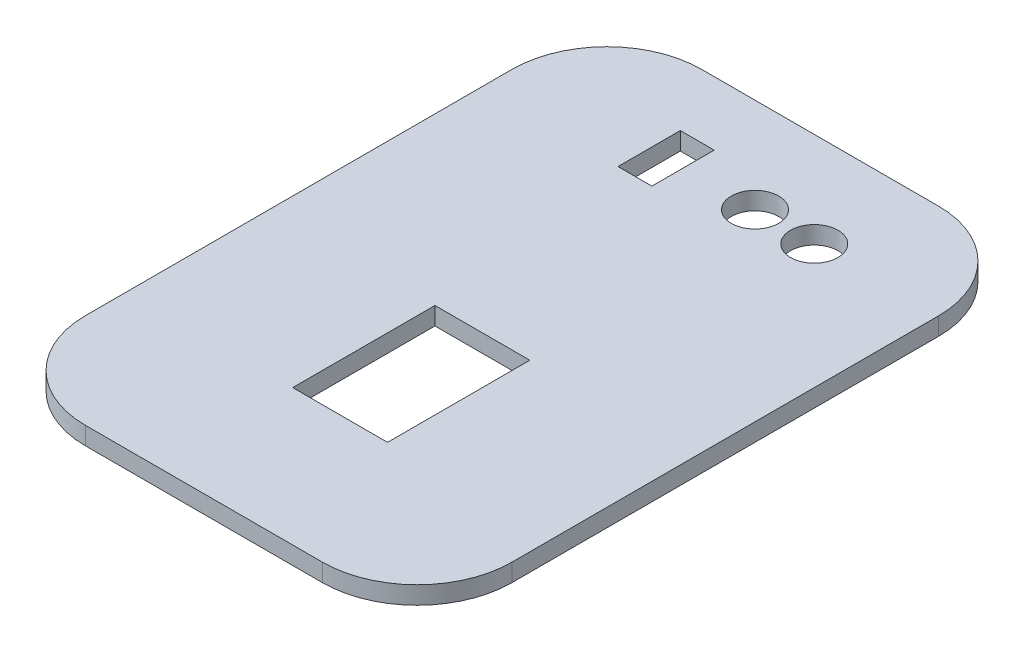
ISO-10303-21;
HEADER;
FILE_DESCRIPTION(('STEP AP214'),'2;1');
FILE_NAME('part.step','',(''),(''),'','','');
FILE_SCHEMA(('AUTOMOTIVE_DESIGN { 1 0 10303 214 1 1 1 1 }'));
ENDSEC;
DATA;
#1=APPLICATION_CONTEXT('core data for automotive mechanical design processes');
#2=APPLICATION_PROTOCOL_DEFINITION('international standard','automotive_design',2000,#1);
#3=PRODUCT_CONTEXT('',#1,'mechanical');
#4=PRODUCT('Part','Part','',(#3));
#5=PRODUCT_RELATED_PRODUCT_CATEGORY('part','',(#4));
#6=PRODUCT_DEFINITION_FORMATION('','',#4);
#7=PRODUCT_DEFINITION_CONTEXT('part definition',#1,'design');
#8=PRODUCT_DEFINITION('design','',#6,#7);
#9=PRODUCT_DEFINITION_SHAPE('','',#8);
#10=(LENGTH_UNIT() NAMED_UNIT(*) SI_UNIT(.MILLI.,.METRE.));
#11=(NAMED_UNIT(*) PLANE_ANGLE_UNIT() SI_UNIT($,.RADIAN.));
#12=(NAMED_UNIT(*) SI_UNIT($,.STERADIAN.) SOLID_ANGLE_UNIT());
#13=UNCERTAINTY_MEASURE_WITH_UNIT(LENGTH_MEASURE(1.E-05),#10,'distance_accuracy_value','');
#14=(GEOMETRIC_REPRESENTATION_CONTEXT(3) GLOBAL_UNCERTAINTY_ASSIGNED_CONTEXT((#13)) GLOBAL_UNIT_ASSIGNED_CONTEXT((#10,
#11,#12)) REPRESENTATION_CONTEXT('',''));
#15=CARTESIAN_POINT('',(0.,0.,0.));
#16=DIRECTION('',(0.,0.,1.));
#17=DIRECTION('',(1.,0.,0.));
#18=AXIS2_PLACEMENT_3D('',#15,#16,#17);
#19=CARTESIAN_POINT('',(0.,-7.5,0.));
#20=DIRECTION('',(0.,-1.,0.));
#21=DIRECTION('',(0.,0.,-1.));
#22=AXIS2_PLACEMENT_3D('',#19,#20,#21);
#23=PLANE('',#22);
#24=CARTESIAN_POINT('',(-50.,-7.5,90.0000000000001));
#25=DIRECTION('',(0.,-1.,0.));
#26=DIRECTION('',(0.,0.,-1.));
#27=AXIS2_PLACEMENT_3D('',#24,#25,#26);
#28=CIRCLE('',#27,40.);
#29=CARTESIAN_POINT('',(-50.,-7.5,130.));
#30=VERTEX_POINT('',#29);
#31=CARTESIAN_POINT('',(-90.,-7.5,90.0000000000001));
#32=VERTEX_POINT('',#31);
#33=EDGE_CURVE('E178',#30,#32,#28,.T.);
#34=ORIENTED_EDGE('',*,*,#33,.T.);
#35=DIRECTION('',(0.,0.,-1.));
#36=VECTOR('',#35,1.);
#37=CARTESIAN_POINT('',(-90.,-7.5,90.0000000000001));
#38=LINE('',#37,#36);
#39=CARTESIAN_POINT('',(-90.,-7.5,-90.));
#40=VERTEX_POINT('',#39);
#41=EDGE_CURVE('E251',#32,#40,#38,.T.);
#42=ORIENTED_EDGE('',*,*,#41,.T.);
#43=CARTESIAN_POINT('',(-50.,-7.5,-89.9999999999999));
#44=DIRECTION('',(0.,-1.,0.));
#45=DIRECTION('',(0.,0.,-1.));
#46=AXIS2_PLACEMENT_3D('',#43,#44,#45);
#47=CIRCLE('',#46,40.);
#48=CARTESIAN_POINT('',(-50.,-7.5,-130.));
#49=VERTEX_POINT('',#48);
#50=EDGE_CURVE('E253',#40,#49,#47,.T.);
#51=ORIENTED_EDGE('',*,*,#50,.T.);
#52=DIRECTION('',(1.,0.,0.));
#53=VECTOR('',#52,1.);
#54=CARTESIAN_POINT('',(-50.,-7.5,-130.));
#55=LINE('',#54,#53);
#56=CARTESIAN_POINT('',(50.,-7.5,-130.));
#57=VERTEX_POINT('',#56);
#58=EDGE_CURVE('E255',#49,#57,#55,.T.);
#59=ORIENTED_EDGE('',*,*,#58,.T.);
#60=CARTESIAN_POINT('',(50.,-7.5,-89.9999999999999));
#61=DIRECTION('',(0.,-1.,0.));
#62=DIRECTION('',(0.,0.,-1.));
#63=AXIS2_PLACEMENT_3D('',#60,#61,#62);
#64=CIRCLE('',#63,40.);
#65=CARTESIAN_POINT('',(90.,-7.5,-89.9999999999999));
#66=VERTEX_POINT('',#65);
#67=EDGE_CURVE('E245',#57,#66,#64,.T.);
#68=ORIENTED_EDGE('',*,*,#67,.T.);
#69=DIRECTION('',(0.,0.,1.));
#70=VECTOR('',#69,1.);
#71=CARTESIAN_POINT('',(90.,-7.5,-89.9999999999999));
#72=LINE('',#71,#70);
#73=CARTESIAN_POINT('',(90.,-7.5,90.0000000000001));
#74=VERTEX_POINT('',#73);
#75=EDGE_CURVE('E249',#66,#74,#72,.T.);
#76=ORIENTED_EDGE('',*,*,#75,.T.);
#77=CARTESIAN_POINT('',(50.,-7.5,90.0000000000001));
#78=DIRECTION('',(0.,-1.,0.));
#79=DIRECTION('',(0.,0.,-1.));
#80=AXIS2_PLACEMENT_3D('',#77,#78,#79);
#81=CIRCLE('',#80,40.);
#82=CARTESIAN_POINT('',(50.,-7.5,130.));
#83=VERTEX_POINT('',#82);
#84=EDGE_CURVE('E197',#74,#83,#81,.T.);
#85=ORIENTED_EDGE('',*,*,#84,.T.);
#86=DIRECTION('',(-1.,0.,0.));
#87=VECTOR('',#86,1.);
#88=CARTESIAN_POINT('',(50.,-7.5,130.));
#89=LINE('',#88,#87);
#90=EDGE_CURVE('E181',#83,#30,#89,.T.);
#91=ORIENTED_EDGE('',*,*,#90,.T.);
#92=EDGE_LOOP('',(#34,#42,#51,#59,#68,#76,#85,#91));
#93=FACE_BOUND('',#92,.T.);
#94=DIRECTION('',(1.,0.,0.));
#95=VECTOR('',#94,1.);
#96=CARTESIAN_POINT('',(20.,-7.5,72.5));
#97=LINE('',#96,#95);
#98=CARTESIAN_POINT('',(-20.,-7.5,72.5));
#99=VERTEX_POINT('',#98);
#100=CARTESIAN_POINT('',(20.,-7.5,72.5));
#101=VERTEX_POINT('',#100);
#102=EDGE_CURVE('E176',#99,#101,#97,.T.);
#103=ORIENTED_EDGE('',*,*,#102,.T.);
#104=DIRECTION('',(0.,0.,-1.));
#105=VECTOR('',#104,1.);
#106=CARTESIAN_POINT('',(20.,-7.5,12.5));
#107=LINE('',#106,#105);
#108=CARTESIAN_POINT('',(20.,-7.5,12.5));
#109=VERTEX_POINT('',#108);
#110=EDGE_CURVE('E36',#101,#109,#107,.T.);
#111=ORIENTED_EDGE('',*,*,#110,.T.);
#112=DIRECTION('',(-1.,0.,0.));
#113=VECTOR('',#112,1.);
#114=CARTESIAN_POINT('',(20.,-7.5,12.5));
#115=LINE('',#114,#113);
#116=CARTESIAN_POINT('',(-20.,-7.5,12.5));
#117=VERTEX_POINT('',#116);
#118=EDGE_CURVE('E166',#109,#117,#115,.T.);
#119=ORIENTED_EDGE('',*,*,#118,.T.);
#120=DIRECTION('',(0.,0.,1.));
#121=VECTOR('',#120,1.);
#122=CARTESIAN_POINT('',(-20.,-7.5,12.5));
#123=LINE('',#122,#121);
#124=EDGE_CURVE('E172',#117,#99,#123,.T.);
#125=ORIENTED_EDGE('',*,*,#124,.T.);
#126=EDGE_LOOP('',(#103,#111,#119,#125));
#127=FACE_BOUND('',#126,.T.);
#128=CARTESIAN_POINT('',(12.5000000000001,-7.5,-89.9999999999999));
#129=DIRECTION('',(0.,-1.,0.));
#130=DIRECTION('',(0.,0.,-1.));
#131=AXIS2_PLACEMENT_3D('',#128,#129,#130);
#132=CIRCLE('',#131,10.);
#133=CARTESIAN_POINT('',(12.5000000000001,-7.5,-99.9999999999999));
#134=VERTEX_POINT('',#133);
#135=EDGE_CURVE('E203',#134,#134,#132,.T.);
#136=ORIENTED_EDGE('',*,*,#135,.F.);
#137=EDGE_LOOP('',(#136));
#138=FACE_BOUND('',#137,.T.);
#139=CARTESIAN_POINT('',(37.5000000000001,-7.5,-89.9999999999999));
#140=DIRECTION('',(0.,-1.,0.));
#141=DIRECTION('',(0.,0.,-1.));
#142=AXIS2_PLACEMENT_3D('',#139,#140,#141);
#143=CIRCLE('',#142,10.);
#144=CARTESIAN_POINT('',(37.5000000000001,-7.5,-99.9999999999999));
#145=VERTEX_POINT('',#144);
#146=EDGE_CURVE('E42',#145,#145,#143,.T.);
#147=ORIENTED_EDGE('',*,*,#146,.F.);
#148=EDGE_LOOP('',(#147));
#149=FACE_BOUND('',#148,.T.);
#150=DIRECTION('',(0.,0.,1.));
#151=VECTOR('',#150,1.);
#152=CARTESIAN_POINT('',(-17.85,-7.5,-76.85));
#153=LINE('',#152,#151);
#154=CARTESIAN_POINT('',(-17.85,-7.5,-103.15));
#155=VERTEX_POINT('',#154);
#156=CARTESIAN_POINT('',(-17.85,-7.5,-76.85));
#157=VERTEX_POINT('',#156);
#158=EDGE_CURVE('E204',#155,#157,#153,.T.);
#159=ORIENTED_EDGE('',*,*,#158,.F.);
#160=DIRECTION('',(1.,0.,0.));
#161=VECTOR('',#160,1.);
#162=CARTESIAN_POINT('',(-32.15,-7.5,-103.15));
#163=LINE('',#162,#161);
#164=CARTESIAN_POINT('',(-32.15,-7.5,-103.15));
#165=VERTEX_POINT('',#164);
#166=EDGE_CURVE('E212',#165,#155,#163,.T.);
#167=ORIENTED_EDGE('',*,*,#166,.F.);
#168=DIRECTION('',(0.,0.,-1.));
#169=VECTOR('',#168,1.);
#170=CARTESIAN_POINT('',(-32.15,-7.5,-76.85));
#171=LINE('',#170,#169);
#172=CARTESIAN_POINT('',(-32.15,-7.5,-76.85));
#173=VERTEX_POINT('',#172);
#174=EDGE_CURVE('E225',#173,#165,#171,.T.);
#175=ORIENTED_EDGE('',*,*,#174,.F.);
#176=DIRECTION('',(-1.,0.,0.));
#177=VECTOR('',#176,1.);
#178=CARTESIAN_POINT('',(-32.15,-7.5,-76.85));
#179=LINE('',#178,#177);
#180=EDGE_CURVE('E223',#157,#173,#179,.T.);
#181=ORIENTED_EDGE('',*,*,#180,.F.);
#182=EDGE_LOOP('',(#159,#167,#175,#181));
#183=FACE_BOUND('',#182,.T.);
#184=ADVANCED_FACE('F32',(#93,#127,#138,#149,#183),#23,.T.);
#185=CARTESIAN_POINT('',(50.,-7.5,130.));
#186=DIRECTION('',(0.,0.,-1.));
#187=DIRECTION('',(-1.,0.,0.));
#188=AXIS2_PLACEMENT_3D('',#185,#186,#187);
#189=PLANE('',#188);
#190=ORIENTED_EDGE('',*,*,#90,.F.);
#191=DIRECTION('',(0.,1.,0.));
#192=VECTOR('',#191,1.);
#193=CARTESIAN_POINT('',(50.,-7.5,130.));
#194=LINE('',#193,#192);
#195=CARTESIAN_POINT('',(50.,0.,130.));
#196=VERTEX_POINT('',#195);
#197=EDGE_CURVE('E190',#83,#196,#194,.T.);
#198=ORIENTED_EDGE('',*,*,#197,.T.);
#199=DIRECTION('',(-1.,0.,0.));
#200=VECTOR('',#199,1.);
#201=CARTESIAN_POINT('',(50.,0.,130.));
#202=LINE('',#201,#200);
#203=CARTESIAN_POINT('',(-50.,0.,130.));
#204=VERTEX_POINT('',#203);
#205=EDGE_CURVE('E266',#196,#204,#202,.T.);
#206=ORIENTED_EDGE('',*,*,#205,.T.);
#207=DIRECTION('',(0.,1.,0.));
#208=VECTOR('',#207,1.);
#209=CARTESIAN_POINT('',(-50.,-7.5,130.));
#210=LINE('',#209,#208);
#211=EDGE_CURVE('E188',#30,#204,#210,.T.);
#212=ORIENTED_EDGE('',*,*,#211,.F.);
#213=EDGE_LOOP('',(#190,#198,#206,#212));
#214=FACE_BOUND('',#213,.T.);
#215=ADVANCED_FACE('F308',(#214),#189,.F.);
#216=CARTESIAN_POINT('',(50.,-7.5,90.0000000000001));
#217=DIRECTION('',(0.,1.,0.));
#218=DIRECTION('',(0.,0.,1.));
#219=AXIS2_PLACEMENT_3D('',#216,#217,#218);
#220=CYLINDRICAL_SURFACE('',#219,40.);
#221=ORIENTED_EDGE('',*,*,#84,.F.);
#222=DIRECTION('',(0.,1.,0.));
#223=VECTOR('',#222,1.);
#224=CARTESIAN_POINT('',(90.,-7.5,90.0000000000001));
#225=LINE('',#224,#223);
#226=CARTESIAN_POINT('',(90.,0.,90.0000000000001));
#227=VERTEX_POINT('',#226);
#228=EDGE_CURVE('E192',#74,#227,#225,.T.);
#229=ORIENTED_EDGE('',*,*,#228,.T.);
#230=CARTESIAN_POINT('',(50.,0.,90.0000000000001));
#231=DIRECTION('',(0.,-1.,0.));
#232=DIRECTION('',(0.,0.,-1.));
#233=AXIS2_PLACEMENT_3D('',#230,#231,#232);
#234=CIRCLE('',#233,40.);
#235=EDGE_CURVE('E263',#227,#196,#234,.T.);
#236=ORIENTED_EDGE('',*,*,#235,.T.);
#237=ORIENTED_EDGE('',*,*,#197,.F.);
#238=EDGE_LOOP('',(#221,#229,#236,#237));
#239=FACE_BOUND('',#238,.T.);
#240=ADVANCED_FACE('F303',(#239),#220,.T.);
#241=CARTESIAN_POINT('',(-50.,-7.5,90.0000000000001));
#242=DIRECTION('',(0.,1.,0.));
#243=DIRECTION('',(0.,0.,1.));
#244=AXIS2_PLACEMENT_3D('',#241,#242,#243);
#245=CYLINDRICAL_SURFACE('',#244,40.);
#246=ORIENTED_EDGE('',*,*,#33,.F.);
#247=ORIENTED_EDGE('',*,*,#211,.T.);
#248=CARTESIAN_POINT('',(-50.,0.,90.0000000000001));
#249=DIRECTION('',(0.,-1.,0.));
#250=DIRECTION('',(0.,0.,-1.));
#251=AXIS2_PLACEMENT_3D('',#248,#249,#250);
#252=CIRCLE('',#251,40.);
#253=CARTESIAN_POINT('',(-90.,0.,90.0000000000001));
#254=VERTEX_POINT('',#253);
#255=EDGE_CURVE('E269',#204,#254,#252,.T.);
#256=ORIENTED_EDGE('',*,*,#255,.T.);
#257=DIRECTION('',(0.,1.,0.));
#258=VECTOR('',#257,1.);
#259=CARTESIAN_POINT('',(-90.,-7.5,90.0000000000001));
#260=LINE('',#259,#258);
#261=EDGE_CURVE('E185',#32,#254,#260,.T.);
#262=ORIENTED_EDGE('',*,*,#261,.F.);
#263=EDGE_LOOP('',(#246,#247,#256,#262));
#264=FACE_BOUND('',#263,.T.);
#265=ADVANCED_FACE('F34',(#264),#245,.T.);
#266=CARTESIAN_POINT('',(-90.,-7.5,90.0000000000001));
#267=DIRECTION('',(1.,0.,0.));
#268=DIRECTION('',(0.,0.,-1.));
#269=AXIS2_PLACEMENT_3D('',#266,#267,#268);
#270=PLANE('',#269);
#271=ORIENTED_EDGE('',*,*,#41,.F.);
#272=ORIENTED_EDGE('',*,*,#261,.T.);
#273=DIRECTION('',(0.,0.,-1.));
#274=VECTOR('',#273,1.);
#275=CARTESIAN_POINT('',(-90.,0.,90.0000000000001));
#276=LINE('',#275,#274);
#277=CARTESIAN_POINT('',(-90.,0.,-90.));
#278=VERTEX_POINT('',#277);
#279=EDGE_CURVE('E272',#254,#278,#276,.T.);
#280=ORIENTED_EDGE('',*,*,#279,.T.);
#281=DIRECTION('',(0.,1.,0.));
#282=VECTOR('',#281,1.);
#283=CARTESIAN_POINT('',(-90.,-7.5,-90.));
#284=LINE('',#283,#282);
#285=EDGE_CURVE('E187',#40,#278,#284,.T.);
#286=ORIENTED_EDGE('',*,*,#285,.F.);
#287=EDGE_LOOP('',(#271,#272,#280,#286));
#288=FACE_BOUND('',#287,.T.);
#289=ADVANCED_FACE('F316',(#288),#270,.F.);
#290=CARTESIAN_POINT('',(-50.,-7.5,-89.9999999999999));
#291=DIRECTION('',(0.,1.,0.));
#292=DIRECTION('',(0.,0.,1.));
#293=AXIS2_PLACEMENT_3D('',#290,#291,#292);
#294=CYLINDRICAL_SURFACE('',#293,40.);
#295=CARTESIAN_POINT('',(-50.,0.,-89.9999999999999));
#296=DIRECTION('',(0.,-1.,0.));
#297=DIRECTION('',(0.,0.,-1.));
#298=AXIS2_PLACEMENT_3D('',#295,#296,#297);
#299=CIRCLE('',#298,40.);
#300=CARTESIAN_POINT('',(-50.,0.,-130.));
#301=VERTEX_POINT('',#300);
#302=EDGE_CURVE('E274',#278,#301,#299,.T.);
#303=ORIENTED_EDGE('',*,*,#302,.T.);
#304=DIRECTION('',(0.,1.,0.));
#305=VECTOR('',#304,1.);
#306=CARTESIAN_POINT('',(-50.,-7.5,-130.));
#307=LINE('',#306,#305);
#308=EDGE_CURVE('E279',#49,#301,#307,.T.);
#309=ORIENTED_EDGE('',*,*,#308,.F.);
#310=ORIENTED_EDGE('',*,*,#50,.F.);
#311=ORIENTED_EDGE('',*,*,#285,.T.);
#312=EDGE_LOOP('',(#303,#309,#310,#311));
#313=FACE_BOUND('',#312,.T.);
#314=ADVANCED_FACE('F318',(#313),#294,.T.);
#315=CARTESIAN_POINT('',(-50.,-7.5,-130.));
#316=DIRECTION('',(0.,0.,1.));
#317=DIRECTION('',(1.,0.,0.));
#318=AXIS2_PLACEMENT_3D('',#315,#316,#317);
#319=PLANE('',#318);
#320=DIRECTION('',(1.,0.,0.));
#321=VECTOR('',#320,1.);
#322=CARTESIAN_POINT('',(-50.,0.,-130.));
#323=LINE('',#322,#321);
#324=CARTESIAN_POINT('',(50.,0.,-130.));
#325=VERTEX_POINT('',#324);
#326=EDGE_CURVE('E248',#301,#325,#323,.T.);
#327=ORIENTED_EDGE('',*,*,#326,.T.);
#328=DIRECTION('',(0.,1.,0.));
#329=VECTOR('',#328,1.);
#330=CARTESIAN_POINT('',(50.,-7.5,-130.));
#331=LINE('',#330,#329);
#332=EDGE_CURVE('E257',#57,#325,#331,.T.);
#333=ORIENTED_EDGE('',*,*,#332,.F.);
#334=ORIENTED_EDGE('',*,*,#58,.F.);
#335=ORIENTED_EDGE('',*,*,#308,.T.);
#336=EDGE_LOOP('',(#327,#333,#334,#335));
#337=FACE_BOUND('',#336,.T.);
#338=ADVANCED_FACE('F321',(#337),#319,.F.);
#339=CARTESIAN_POINT('',(90.,-7.5,-89.9999999999999));
#340=DIRECTION('',(-1.,0.,0.));
#341=DIRECTION('',(0.,0.,1.));
#342=AXIS2_PLACEMENT_3D('',#339,#340,#341);
#343=PLANE('',#342);
#344=ORIENTED_EDGE('',*,*,#228,.F.);
#345=ORIENTED_EDGE('',*,*,#75,.F.);
#346=DIRECTION('',(0.,1.,0.));
#347=VECTOR('',#346,1.);
#348=CARTESIAN_POINT('',(90.,-7.5,-89.9999999999999));
#349=LINE('',#348,#347);
#350=CARTESIAN_POINT('',(90.,0.,-89.9999999999999));
#351=VERTEX_POINT('',#350);
#352=EDGE_CURVE('E193',#66,#351,#349,.T.);
#353=ORIENTED_EDGE('',*,*,#352,.T.);
#354=DIRECTION('',(0.,0.,1.));
#355=VECTOR('',#354,1.);
#356=CARTESIAN_POINT('',(90.,0.,-89.9999999999999));
#357=LINE('',#356,#355);
#358=EDGE_CURVE('E260',#351,#227,#357,.T.);
#359=ORIENTED_EDGE('',*,*,#358,.T.);
#360=EDGE_LOOP('',(#344,#345,#353,#359));
#361=FACE_BOUND('',#360,.T.);
#362=ADVANCED_FACE('F288',(#361),#343,.F.);
#363=CARTESIAN_POINT('',(-20.,0.,12.5));
#364=DIRECTION('',(0.,0.,-1.));
#365=DIRECTION('',(-1.,0.,0.));
#366=AXIS2_PLACEMENT_3D('',#363,#364,#365);
#367=PLANE('',#366);
#368=ORIENTED_EDGE('',*,*,#118,.F.);
#369=DIRECTION('',(0.,-1.,0.));
#370=VECTOR('',#369,1.);
#371=CARTESIAN_POINT('',(20.,0.,12.5));
#372=LINE('',#371,#370);
#373=CARTESIAN_POINT('',(20.,0.,12.5));
#374=VERTEX_POINT('',#373);
#375=EDGE_CURVE('E153',#374,#109,#372,.T.);
#376=ORIENTED_EDGE('',*,*,#375,.F.);
#377=DIRECTION('',(1.,0.,0.));
#378=VECTOR('',#377,1.);
#379=CARTESIAN_POINT('',(-20.,0.,12.5));
#380=LINE('',#379,#378);
#381=CARTESIAN_POINT('',(-20.,0.,12.5));
#382=VERTEX_POINT('',#381);
#383=EDGE_CURVE('E229',#382,#374,#380,.T.);
#384=ORIENTED_EDGE('',*,*,#383,.F.);
#385=DIRECTION('',(0.,-1.,0.));
#386=VECTOR('',#385,1.);
#387=CARTESIAN_POINT('',(-20.,0.,12.5));
#388=LINE('',#387,#386);
#389=EDGE_CURVE('E168',#382,#117,#388,.T.);
#390=ORIENTED_EDGE('',*,*,#389,.T.);
#391=EDGE_LOOP('',(#368,#376,#384,#390));
#392=FACE_BOUND('',#391,.T.);
#393=ADVANCED_FACE('F167',(#392),#367,.F.);
#394=CARTESIAN_POINT('',(-32.15,0.,-103.15));
#395=DIRECTION('',(0.,0.,-1.));
#396=DIRECTION('',(-1.,0.,0.));
#397=AXIS2_PLACEMENT_3D('',#394,#395,#396);
#398=PLANE('',#397);
#399=ORIENTED_EDGE('',*,*,#166,.T.);
#400=DIRECTION('',(0.,-1.,0.));
#401=VECTOR('',#400,1.);
#402=CARTESIAN_POINT('',(-17.85,0.,-103.15));
#403=LINE('',#402,#401);
#404=CARTESIAN_POINT('',(-17.85,0.,-103.15));
#405=VERTEX_POINT('',#404);
#406=EDGE_CURVE('E73',#405,#155,#403,.T.);
#407=ORIENTED_EDGE('',*,*,#406,.F.);
#408=DIRECTION('',(1.,0.,0.));
#409=VECTOR('',#408,1.);
#410=CARTESIAN_POINT('',(-32.15,0.,-103.15));
#411=LINE('',#410,#409);
#412=CARTESIAN_POINT('',(-32.15,0.,-103.15));
#413=VERTEX_POINT('',#412);
#414=EDGE_CURVE('E219',#413,#405,#411,.T.);
#415=ORIENTED_EDGE('',*,*,#414,.F.);
#416=DIRECTION('',(0.,-1.,0.));
#417=VECTOR('',#416,1.);
#418=CARTESIAN_POINT('',(-32.15,0.,-103.15));
#419=LINE('',#418,#417);
#420=EDGE_CURVE('E63',#413,#165,#419,.T.);
#421=ORIENTED_EDGE('',*,*,#420,.T.);
#422=EDGE_LOOP('',(#399,#407,#415,#421));
#423=FACE_BOUND('',#422,.T.);
#424=ADVANCED_FACE('F350',(#423),#398,.F.);
#425=CARTESIAN_POINT('',(-17.85,0.,-76.85));
#426=DIRECTION('',(1.,0.,0.));
#427=DIRECTION('',(0.,0.,-1.));
#428=AXIS2_PLACEMENT_3D('',#425,#426,#427);
#429=PLANE('',#428);
#430=ORIENTED_EDGE('',*,*,#158,.T.);
#431=DIRECTION('',(0.,-1.,0.));
#432=VECTOR('',#431,1.);
#433=CARTESIAN_POINT('',(-17.85,0.,-76.85));
#434=LINE('',#433,#432);
#435=CARTESIAN_POINT('',(-17.85,0.,-76.85));
#436=VERTEX_POINT('',#435);
#437=EDGE_CURVE('E70',#436,#157,#434,.T.);
#438=ORIENTED_EDGE('',*,*,#437,.F.);
#439=DIRECTION('',(0.,0.,1.));
#440=VECTOR('',#439,1.);
#441=CARTESIAN_POINT('',(-17.85,0.,-76.85));
#442=LINE('',#441,#440);
#443=EDGE_CURVE('E209',#405,#436,#442,.T.);
#444=ORIENTED_EDGE('',*,*,#443,.F.);
#445=ORIENTED_EDGE('',*,*,#406,.T.);
#446=EDGE_LOOP('',(#430,#438,#444,#445));
#447=FACE_BOUND('',#446,.T.);
#448=ADVANCED_FACE('F353',(#447),#429,.F.);
#449=CARTESIAN_POINT('',(50.,0.,-89.9999999999999));
#450=DIRECTION('',(0.,-1.,0.));
#451=DIRECTION('',(0.,0.,-1.));
#452=AXIS2_PLACEMENT_3D('',#449,#450,#451);
#453=PLANE('',#452);
#454=CARTESIAN_POINT('',(12.5000000000001,0.,-89.9999999999999));
#455=DIRECTION('',(0.,-1.,0.));
#456=DIRECTION('',(0.,0.,-1.));
#457=AXIS2_PLACEMENT_3D('',#454,#455,#456);
#458=CIRCLE('',#457,10.);
#459=CARTESIAN_POINT('',(12.5000000000001,0.,-99.9999999999999));
#460=VERTEX_POINT('',#459);
#461=EDGE_CURVE('E200',#460,#460,#458,.T.);
#462=ORIENTED_EDGE('',*,*,#461,.T.);
#463=EDGE_LOOP('',(#462));
#464=FACE_BOUND('',#463,.T.);
#465=CARTESIAN_POINT('',(37.5000000000001,0.,-89.9999999999999));
#466=DIRECTION('',(0.,-1.,0.));
#467=DIRECTION('',(0.,0.,-1.));
#468=AXIS2_PLACEMENT_3D('',#465,#466,#467);
#469=CIRCLE('',#468,10.);
#470=CARTESIAN_POINT('',(37.5000000000001,0.,-99.9999999999999));
#471=VERTEX_POINT('',#470);
#472=EDGE_CURVE('E11',#471,#471,#469,.T.);
#473=ORIENTED_EDGE('',*,*,#472,.T.);
#474=EDGE_LOOP('',(#473));
#475=FACE_BOUND('',#474,.T.);
#476=ORIENTED_EDGE('',*,*,#414,.T.);
#477=ORIENTED_EDGE('',*,*,#443,.T.);
#478=DIRECTION('',(-1.,0.,0.));
#479=VECTOR('',#478,1.);
#480=CARTESIAN_POINT('',(-32.15,0.,-76.85));
#481=LINE('',#480,#479);
#482=CARTESIAN_POINT('',(-32.15,0.,-76.85));
#483=VERTEX_POINT('',#482);
#484=EDGE_CURVE('E213',#436,#483,#481,.T.);
#485=ORIENTED_EDGE('',*,*,#484,.T.);
#486=DIRECTION('',(0.,0.,-1.));
#487=VECTOR('',#486,1.);
#488=CARTESIAN_POINT('',(-32.15,0.,-76.85));
#489=LINE('',#488,#487);
#490=EDGE_CURVE('E216',#483,#413,#489,.T.);
#491=ORIENTED_EDGE('',*,*,#490,.T.);
#492=EDGE_LOOP('',(#476,#477,#485,#491));
#493=FACE_BOUND('',#492,.T.);
#494=DIRECTION('',(0.,0.,-1.));
#495=VECTOR('',#494,1.);
#496=CARTESIAN_POINT('',(-20.,0.,72.5));
#497=LINE('',#496,#495);
#498=CARTESIAN_POINT('',(-20.,0.,72.5));
#499=VERTEX_POINT('',#498);
#500=EDGE_CURVE('E162',#499,#382,#497,.T.);
#501=ORIENTED_EDGE('',*,*,#500,.T.);
#502=ORIENTED_EDGE('',*,*,#383,.T.);
#503=DIRECTION('',(0.,0.,-1.));
#504=VECTOR('',#503,1.);
#505=CARTESIAN_POINT('',(20.,0.,72.5));
#506=LINE('',#505,#504);
#507=CARTESIAN_POINT('',(20.,0.,72.5));
#508=VERTEX_POINT('',#507);
#509=EDGE_CURVE('E158',#508,#374,#506,.T.);
#510=ORIENTED_EDGE('',*,*,#509,.F.);
#511=DIRECTION('',(1.,0.,0.));
#512=VECTOR('',#511,1.);
#513=CARTESIAN_POINT('',(-20.,0.,72.5));
#514=LINE('',#513,#512);
#515=EDGE_CURVE('E235',#499,#508,#514,.T.);
#516=ORIENTED_EDGE('',*,*,#515,.F.);
#517=EDGE_LOOP('',(#501,#502,#510,#516));
#518=FACE_BOUND('',#517,.T.);
#519=CARTESIAN_POINT('',(50.,0.,-89.9999999999999));
#520=DIRECTION('',(0.,-1.,0.));
#521=DIRECTION('',(0.,0.,-1.));
#522=AXIS2_PLACEMENT_3D('',#519,#520,#521);
#523=CIRCLE('',#522,40.);
#524=EDGE_CURVE('E242',#325,#351,#523,.T.);
#525=ORIENTED_EDGE('',*,*,#524,.F.);
#526=ORIENTED_EDGE('',*,*,#326,.F.);
#527=ORIENTED_EDGE('',*,*,#302,.F.);
#528=ORIENTED_EDGE('',*,*,#279,.F.);
#529=ORIENTED_EDGE('',*,*,#255,.F.);
#530=ORIENTED_EDGE('',*,*,#205,.F.);
#531=ORIENTED_EDGE('',*,*,#235,.F.);
#532=ORIENTED_EDGE('',*,*,#358,.F.);
#533=EDGE_LOOP('',(#525,#526,#527,#528,#529,#530,#531,#532));
#534=FACE_BOUND('',#533,.T.);
#535=ADVANCED_FACE('F297',(#464,#475,#493,#518,#534),#453,.F.);
#536=CARTESIAN_POINT('',(12.5000000000001,0.,-89.9999999999999));
#537=DIRECTION('',(0.,-1.,0.));
#538=DIRECTION('',(0.,0.,-1.));
#539=AXIS2_PLACEMENT_3D('',#536,#537,#538);
#540=CYLINDRICAL_SURFACE('',#539,10.);
#541=ORIENTED_EDGE('',*,*,#461,.F.);
#542=EDGE_LOOP('',(#541));
#543=FACE_BOUND('',#542,.T.);
#544=ORIENTED_EDGE('',*,*,#135,.T.);
#545=EDGE_LOOP('',(#544));
#546=FACE_BOUND('',#545,.T.);
#547=ADVANCED_FACE('F341',(#543,#546),#540,.F.);
#548=CARTESIAN_POINT('',(37.5000000000001,0.,-89.9999999999999));
#549=DIRECTION('',(0.,-1.,0.));
#550=DIRECTION('',(0.,0.,-1.));
#551=AXIS2_PLACEMENT_3D('',#548,#549,#550);
#552=CYLINDRICAL_SURFACE('',#551,10.);
#553=ORIENTED_EDGE('',*,*,#472,.F.);
#554=EDGE_LOOP('',(#553));
#555=FACE_BOUND('',#554,.T.);
#556=ORIENTED_EDGE('',*,*,#146,.T.);
#557=EDGE_LOOP('',(#556));
#558=FACE_BOUND('',#557,.T.);
#559=ADVANCED_FACE('F344',(#555,#558),#552,.F.);
#560=CARTESIAN_POINT('',(-32.15,0.,-76.85));
#561=DIRECTION('',(-1.,0.,0.));
#562=DIRECTION('',(0.,0.,1.));
#563=AXIS2_PLACEMENT_3D('',#560,#561,#562);
#564=PLANE('',#563);
#565=ORIENTED_EDGE('',*,*,#174,.T.);
#566=ORIENTED_EDGE('',*,*,#420,.F.);
#567=ORIENTED_EDGE('',*,*,#490,.F.);
#568=DIRECTION('',(0.,-1.,0.));
#569=VECTOR('',#568,1.);
#570=CARTESIAN_POINT('',(-32.15,0.,-76.85));
#571=LINE('',#570,#569);
#572=EDGE_CURVE('E51',#483,#173,#571,.T.);
#573=ORIENTED_EDGE('',*,*,#572,.T.);
#574=EDGE_LOOP('',(#565,#566,#567,#573));
#575=FACE_BOUND('',#574,.T.);
#576=ADVANCED_FACE('F348',(#575),#564,.F.);
#577=CARTESIAN_POINT('',(-32.15,0.,-76.85));
#578=DIRECTION('',(0.,0.,1.));
#579=DIRECTION('',(1.,0.,0.));
#580=AXIS2_PLACEMENT_3D('',#577,#578,#579);
#581=PLANE('',#580);
#582=ORIENTED_EDGE('',*,*,#180,.T.);
#583=ORIENTED_EDGE('',*,*,#572,.F.);
#584=ORIENTED_EDGE('',*,*,#484,.F.);
#585=ORIENTED_EDGE('',*,*,#437,.T.);
#586=EDGE_LOOP('',(#582,#583,#584,#585));
#587=FACE_BOUND('',#586,.T.);
#588=ADVANCED_FACE('F357',(#587),#581,.F.);
#589=CARTESIAN_POINT('',(-20.,0.,72.5));
#590=DIRECTION('',(-1.,0.,0.));
#591=DIRECTION('',(0.,0.,1.));
#592=AXIS2_PLACEMENT_3D('',#589,#590,#591);
#593=PLANE('',#592);
#594=ORIENTED_EDGE('',*,*,#124,.F.);
#595=ORIENTED_EDGE('',*,*,#389,.F.);
#596=ORIENTED_EDGE('',*,*,#500,.F.);
#597=DIRECTION('',(0.,-1.,0.));
#598=VECTOR('',#597,1.);
#599=CARTESIAN_POINT('',(-20.,0.,72.5));
#600=LINE('',#599,#598);
#601=EDGE_CURVE('E241',#499,#99,#600,.T.);
#602=ORIENTED_EDGE('',*,*,#601,.T.);
#603=EDGE_LOOP('',(#594,#595,#596,#602));
#604=FACE_BOUND('',#603,.T.);
#605=ADVANCED_FACE('F360',(#604),#593,.F.);
#606=CARTESIAN_POINT('',(20.,0.,72.5));
#607=DIRECTION('',(-1.,0.,0.));
#608=DIRECTION('',(0.,0.,1.));
#609=AXIS2_PLACEMENT_3D('',#606,#607,#608);
#610=PLANE('',#609);
#611=ORIENTED_EDGE('',*,*,#375,.T.);
#612=ORIENTED_EDGE('',*,*,#110,.F.);
#613=DIRECTION('',(0.,-1.,0.));
#614=VECTOR('',#613,1.);
#615=CARTESIAN_POINT('',(20.,0.,72.5));
#616=LINE('',#615,#614);
#617=EDGE_CURVE('E163',#508,#101,#616,.T.);
#618=ORIENTED_EDGE('',*,*,#617,.F.);
#619=ORIENTED_EDGE('',*,*,#509,.T.);
#620=EDGE_LOOP('',(#611,#612,#618,#619));
#621=FACE_BOUND('',#620,.T.);
#622=ADVANCED_FACE('F155',(#621),#610,.T.);
#623=CARTESIAN_POINT('',(-20.,0.,72.5));
#624=DIRECTION('',(0.,0.,-1.));
#625=DIRECTION('',(-1.,0.,0.));
#626=AXIS2_PLACEMENT_3D('',#623,#624,#625);
#627=PLANE('',#626);
#628=ORIENTED_EDGE('',*,*,#617,.T.);
#629=ORIENTED_EDGE('',*,*,#102,.F.);
#630=ORIENTED_EDGE('',*,*,#601,.F.);
#631=ORIENTED_EDGE('',*,*,#515,.T.);
#632=EDGE_LOOP('',(#628,#629,#630,#631));
#633=FACE_BOUND('',#632,.T.);
#634=ADVANCED_FACE('F367',(#633),#627,.T.);
#635=CARTESIAN_POINT('',(50.,-7.5,-89.9999999999999));
#636=DIRECTION('',(0.,1.,0.));
#637=DIRECTION('',(0.,0.,1.));
#638=AXIS2_PLACEMENT_3D('',#635,#636,#637);
#639=CYLINDRICAL_SURFACE('',#638,40.);
#640=ORIENTED_EDGE('',*,*,#524,.T.);
#641=ORIENTED_EDGE('',*,*,#352,.F.);
#642=ORIENTED_EDGE('',*,*,#67,.F.);
#643=ORIENTED_EDGE('',*,*,#332,.T.);
#644=EDGE_LOOP('',(#640,#641,#642,#643));
#645=FACE_BOUND('',#644,.T.);
#646=ADVANCED_FACE('F293',(#645),#639,.T.);
#647=CLOSED_SHELL('',(#184,#215,#240,#265,#289,#314,#338,#362,#393,#424,#448,#535,#547,#559,
#576,#588,#605,#622,#634,#646));
#648=MANIFOLD_SOLID_BREP('B2',#647);
#649=ADVANCED_BREP_SHAPE_REPRESENTATION('',(#18,#648),#14);
#650=SHAPE_DEFINITION_REPRESENTATION(#9,#649);
ENDSEC;
END-ISO-10303-21;
